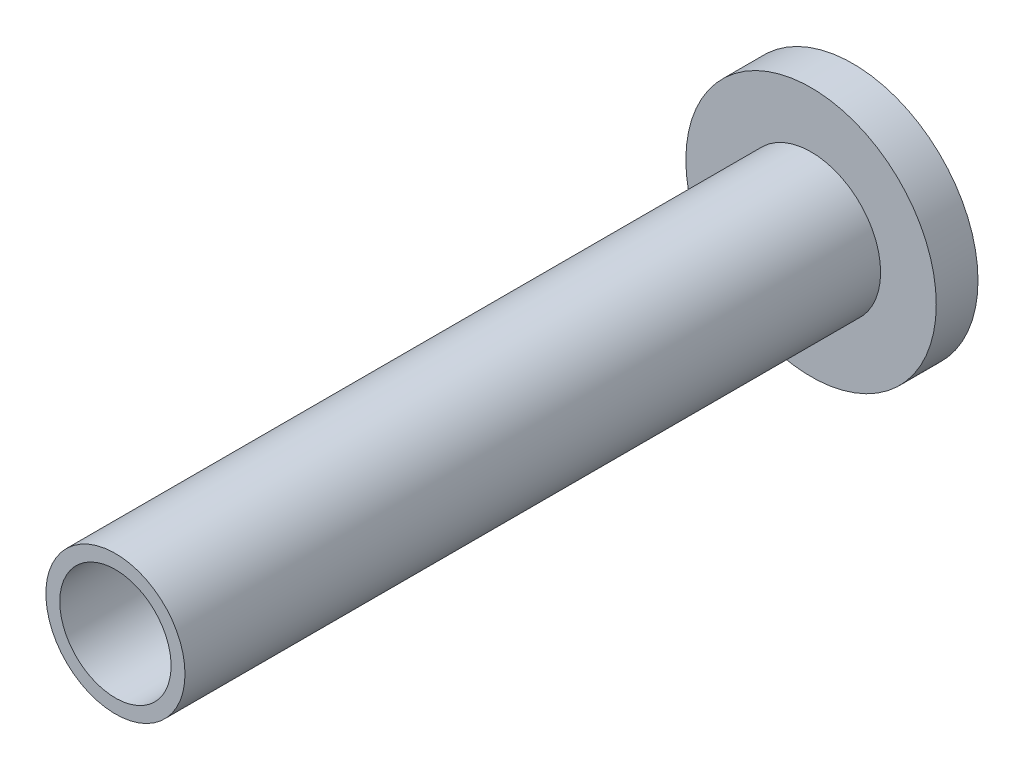
ISO-10303-21;
HEADER;
FILE_DESCRIPTION(('STEP AP214'),'2;1');
FILE_NAME('part.step','',(''),(''),'','','');
FILE_SCHEMA(('AUTOMOTIVE_DESIGN { 1 0 10303 214 1 1 1 1 }'));
ENDSEC;
DATA;
#1=APPLICATION_CONTEXT('core data for automotive mechanical design processes');
#2=APPLICATION_PROTOCOL_DEFINITION('international standard','automotive_design',2000,#1);
#3=PRODUCT_CONTEXT('',#1,'mechanical');
#4=PRODUCT('Part','Part','',(#3));
#5=PRODUCT_RELATED_PRODUCT_CATEGORY('part','',(#4));
#6=PRODUCT_DEFINITION_FORMATION('','',#4);
#7=PRODUCT_DEFINITION_CONTEXT('part definition',#1,'design');
#8=PRODUCT_DEFINITION('design','',#6,#7);
#9=PRODUCT_DEFINITION_SHAPE('','',#8);
#10=(LENGTH_UNIT() NAMED_UNIT(*) SI_UNIT(.MILLI.,.METRE.));
#11=(NAMED_UNIT(*) PLANE_ANGLE_UNIT() SI_UNIT($,.RADIAN.));
#12=(NAMED_UNIT(*) SI_UNIT($,.STERADIAN.) SOLID_ANGLE_UNIT());
#13=UNCERTAINTY_MEASURE_WITH_UNIT(LENGTH_MEASURE(1.E-05),#10,'distance_accuracy_value','');
#14=(GEOMETRIC_REPRESENTATION_CONTEXT(3) GLOBAL_UNCERTAINTY_ASSIGNED_CONTEXT((#13)) GLOBAL_UNIT_ASSIGNED_CONTEXT((#10,
#11,#12)) REPRESENTATION_CONTEXT('',''));
#15=CARTESIAN_POINT('',(0.,0.,0.));
#16=DIRECTION('',(0.,0.,1.));
#17=DIRECTION('',(1.,0.,0.));
#18=AXIS2_PLACEMENT_3D('',#15,#16,#17);
#19=CARTESIAN_POINT('',(0.,0.,25.));
#20=DIRECTION('',(0.,0.,-1.));
#21=DIRECTION('',(-1.,0.,0.));
#22=AXIS2_PLACEMENT_3D('',#19,#20,#21);
#23=CYLINDRICAL_SURFACE('',#22,2.5);
#24=CARTESIAN_POINT('',(0.,0.,25.));
#25=DIRECTION('',(0.,0.,1.));
#26=DIRECTION('',(1.,0.,0.));
#27=AXIS2_PLACEMENT_3D('',#24,#25,#26);
#28=CIRCLE('',#27,2.5);
#29=CARTESIAN_POINT('',(2.5,0.,25.));
#30=VERTEX_POINT('',#29);
#31=EDGE_CURVE('E11',#30,#30,#28,.T.);
#32=ORIENTED_EDGE('',*,*,#31,.F.);
#33=EDGE_LOOP('',(#32));
#34=FACE_BOUND('',#33,.T.);
#35=CARTESIAN_POINT('',(0.,0.,0.));
#36=DIRECTION('',(0.,0.,1.));
#37=DIRECTION('',(1.,0.,0.));
#38=AXIS2_PLACEMENT_3D('',#35,#36,#37);
#39=CIRCLE('',#38,2.5);
#40=CARTESIAN_POINT('',(2.5,0.,0.));
#41=VERTEX_POINT('',#40);
#42=EDGE_CURVE('E57',#41,#41,#39,.T.);
#43=ORIENTED_EDGE('',*,*,#42,.T.);
#44=EDGE_LOOP('',(#43));
#45=FACE_BOUND('',#44,.T.);
#46=ADVANCED_FACE('F49',(#34,#45),#23,.T.);
#47=CARTESIAN_POINT('',(0.,0.,25.));
#48=DIRECTION('',(0.,0.,1.));
#49=DIRECTION('',(1.,0.,0.));
#50=AXIS2_PLACEMENT_3D('',#47,#48,#49);
#51=PLANE('',#50);
#52=CARTESIAN_POINT('',(0.,0.,25.));
#53=DIRECTION('',(0.,0.,1.));
#54=DIRECTION('',(1.,0.,0.));
#55=AXIS2_PLACEMENT_3D('',#52,#53,#54);
#56=CIRCLE('',#55,2.);
#57=CARTESIAN_POINT('',(-2.,0.,25.));
#58=VERTEX_POINT('',#57);
#59=EDGE_CURVE('E52',#58,#58,#56,.F.);
#60=ORIENTED_EDGE('',*,*,#59,.T.);
#61=EDGE_LOOP('',(#60));
#62=FACE_BOUND('',#61,.T.);
#63=ORIENTED_EDGE('',*,*,#31,.T.);
#64=EDGE_LOOP('',(#63));
#65=FACE_BOUND('',#64,.T.);
#66=ADVANCED_FACE('F242',(#62,#65),#51,.T.);
#67=CARTESIAN_POINT('',(0.,0.,0.));
#68=DIRECTION('',(0.,0.,1.));
#69=DIRECTION('',(1.,0.,0.));
#70=AXIS2_PLACEMENT_3D('',#67,#68,#69);
#71=PLANE('',#70);
#72=CARTESIAN_POINT('',(0.,0.,0.));
#73=DIRECTION('',(0.,0.,1.));
#74=DIRECTION('',(1.,0.,0.));
#75=AXIS2_PLACEMENT_3D('',#72,#73,#74);
#76=CIRCLE('',#75,4.5);
#77=CARTESIAN_POINT('',(4.5,0.,0.));
#78=VERTEX_POINT('',#77);
#79=EDGE_CURVE('E159',#78,#78,#76,.T.);
#80=ORIENTED_EDGE('',*,*,#79,.T.);
#81=EDGE_LOOP('',(#80));
#82=FACE_BOUND('',#81,.T.);
#83=ORIENTED_EDGE('',*,*,#42,.F.);
#84=EDGE_LOOP('',(#83));
#85=FACE_BOUND('',#84,.T.);
#86=ADVANCED_FACE('F240',(#82,#85),#71,.T.);
#87=CARTESIAN_POINT('',(0.115769453402899,0.,-1.5));
#88=DIRECTION('',(1.,0.,0.));
#89=DIRECTION('',(0.,0.,-1.));
#90=AXIS2_PLACEMENT_3D('',#87,#88,#89);
#91=PLANE('',#90);
#92=DIRECTION('',(0.,1.,0.));
#93=VECTOR('',#92,1.);
#94=CARTESIAN_POINT('',(0.115769453402899,0.,0.));
#95=LINE('',#94,#93);
#96=CARTESIAN_POINT('',(0.115769453402899,-1.71873111590303,0.));
#97=VERTEX_POINT('',#96);
#98=CARTESIAN_POINT('',(0.115769453402899,-0.115769453402899,0.));
#99=VERTEX_POINT('',#98);
#100=EDGE_CURVE('E65',#97,#99,#95,.T.);
#101=ORIENTED_EDGE('',*,*,#100,.T.);
#102=DIRECTION('',(0.,0.,1.));
#103=VECTOR('',#102,1.);
#104=CARTESIAN_POINT('',(0.115769453402899,-0.115769453402899,-1.5));
#105=LINE('',#104,#103);
#106=CARTESIAN_POINT('',(0.115769453402899,-0.115769453402899,-1.5));
#107=VERTEX_POINT('',#106);
#108=EDGE_CURVE('E158',#107,#99,#105,.T.);
#109=ORIENTED_EDGE('',*,*,#108,.F.);
#110=DIRECTION('',(0.,1.,0.));
#111=VECTOR('',#110,1.);
#112=CARTESIAN_POINT('',(0.115769453402899,0.,-1.5));
#113=LINE('',#112,#111);
#114=CARTESIAN_POINT('',(0.115769453402899,-1.71873111590303,-1.5));
#115=VERTEX_POINT('',#114);
#116=EDGE_CURVE('E143',#115,#107,#113,.T.);
#117=ORIENTED_EDGE('',*,*,#116,.F.);
#118=DIRECTION('',(0.,0.,1.));
#119=VECTOR('',#118,1.);
#120=CARTESIAN_POINT('',(0.115769453402899,-1.71873111590303,-1.5));
#121=LINE('',#120,#119);
#122=EDGE_CURVE('E150',#115,#97,#121,.T.);
#123=ORIENTED_EDGE('',*,*,#122,.T.);
#124=EDGE_LOOP('',(#101,#109,#117,#123));
#125=FACE_BOUND('',#124,.T.);
#126=ADVANCED_FACE('F156',(#125),#91,.F.);
#127=CARTESIAN_POINT('',(0.,-0.115769453402899,-1.5));
#128=DIRECTION('',(0.,-1.,0.));
#129=DIRECTION('',(0.,0.,-1.));
#130=AXIS2_PLACEMENT_3D('',#127,#128,#129);
#131=PLANE('',#130);
#132=DIRECTION('',(1.,0.,0.));
#133=VECTOR('',#132,1.);
#134=CARTESIAN_POINT('',(0.,-0.115769453402899,0.));
#135=LINE('',#134,#133);
#136=CARTESIAN_POINT('',(1.71873111590303,-0.115769453402899,0.));
#137=VERTEX_POINT('',#136);
#138=EDGE_CURVE('E163',#99,#137,#135,.T.);
#139=ORIENTED_EDGE('',*,*,#138,.T.);
#140=DIRECTION('',(0.,0.,1.));
#141=VECTOR('',#140,1.);
#142=CARTESIAN_POINT('',(1.71873111590303,-0.115769453402899,-1.5));
#143=LINE('',#142,#141);
#144=CARTESIAN_POINT('',(1.71873111590303,-0.115769453402899,-1.5));
#145=VERTEX_POINT('',#144);
#146=EDGE_CURVE('E210',#145,#137,#143,.T.);
#147=ORIENTED_EDGE('',*,*,#146,.F.);
#148=DIRECTION('',(1.,0.,0.));
#149=VECTOR('',#148,1.);
#150=CARTESIAN_POINT('',(0.,-0.115769453402899,-1.5));
#151=LINE('',#150,#149);
#152=EDGE_CURVE('E187',#107,#145,#151,.T.);
#153=ORIENTED_EDGE('',*,*,#152,.F.);
#154=ORIENTED_EDGE('',*,*,#108,.T.);
#155=EDGE_LOOP('',(#139,#147,#153,#154));
#156=FACE_BOUND('',#155,.T.);
#157=ADVANCED_FACE('F249',(#156),#131,.F.);
#158=CARTESIAN_POINT('',(1.71873111590303,0.,-1.5));
#159=DIRECTION('',(-1.,0.,0.));
#160=DIRECTION('',(0.,0.,1.));
#161=AXIS2_PLACEMENT_3D('',#158,#159,#160);
#162=PLANE('',#161);
#163=DIRECTION('',(0.,-1.,0.));
#164=VECTOR('',#163,1.);
#165=CARTESIAN_POINT('',(1.71873111590303,0.,0.));
#166=LINE('',#165,#164);
#167=CARTESIAN_POINT('',(1.71873111590303,0.115769453402899,0.));
#168=VERTEX_POINT('',#167);
#169=EDGE_CURVE('E207',#168,#137,#166,.T.);
#170=ORIENTED_EDGE('',*,*,#169,.F.);
#171=DIRECTION('',(0.,0.,1.));
#172=VECTOR('',#171,1.);
#173=CARTESIAN_POINT('',(1.71873111590303,0.115769453402899,-1.5));
#174=LINE('',#173,#172);
#175=CARTESIAN_POINT('',(1.71873111590303,0.115769453402899,-1.5));
#176=VERTEX_POINT('',#175);
#177=EDGE_CURVE('E213',#176,#168,#174,.T.);
#178=ORIENTED_EDGE('',*,*,#177,.F.);
#179=DIRECTION('',(0.,-1.,0.));
#180=VECTOR('',#179,1.);
#181=CARTESIAN_POINT('',(1.71873111590303,0.,-1.5));
#182=LINE('',#181,#180);
#183=EDGE_CURVE('E173',#176,#145,#182,.T.);
#184=ORIENTED_EDGE('',*,*,#183,.T.);
#185=ORIENTED_EDGE('',*,*,#146,.T.);
#186=EDGE_LOOP('',(#170,#178,#184,#185));
#187=FACE_BOUND('',#186,.T.);
#188=ADVANCED_FACE('F298',(#187),#162,.T.);
#189=CARTESIAN_POINT('',(0.,0.115769453402899,-1.5));
#190=DIRECTION('',(0.,-1.,0.));
#191=DIRECTION('',(0.,0.,-1.));
#192=AXIS2_PLACEMENT_3D('',#189,#190,#191);
#193=PLANE('',#192);
#194=DIRECTION('',(1.,0.,0.));
#195=VECTOR('',#194,1.);
#196=CARTESIAN_POINT('',(0.,0.115769453402899,0.));
#197=LINE('',#196,#195);
#198=CARTESIAN_POINT('',(0.115769453402899,0.115769453402899,0.));
#199=VERTEX_POINT('',#198);
#200=EDGE_CURVE('E204',#199,#168,#197,.T.);
#201=ORIENTED_EDGE('',*,*,#200,.F.);
#202=DIRECTION('',(0.,0.,1.));
#203=VECTOR('',#202,1.);
#204=CARTESIAN_POINT('',(0.115769453402899,0.115769453402899,-1.5));
#205=LINE('',#204,#203);
#206=CARTESIAN_POINT('',(0.115769453402899,0.115769453402899,-1.5));
#207=VERTEX_POINT('',#206);
#208=EDGE_CURVE('E216',#207,#199,#205,.T.);
#209=ORIENTED_EDGE('',*,*,#208,.F.);
#210=DIRECTION('',(1.,0.,0.));
#211=VECTOR('',#210,1.);
#212=CARTESIAN_POINT('',(0.,0.115769453402899,-1.5));
#213=LINE('',#212,#211);
#214=EDGE_CURVE('E166',#207,#176,#213,.T.);
#215=ORIENTED_EDGE('',*,*,#214,.T.);
#216=ORIENTED_EDGE('',*,*,#177,.T.);
#217=EDGE_LOOP('',(#201,#209,#215,#216));
#218=FACE_BOUND('',#217,.T.);
#219=ADVANCED_FACE('F309',(#218),#193,.T.);
#220=CARTESIAN_POINT('',(0.115769453402899,1.71873111590303,0.));
#221=VERTEX_POINT('',#220);
#222=EDGE_CURVE('E191',#199,#221,#95,.T.);
#223=ORIENTED_EDGE('',*,*,#222,.T.);
#224=DIRECTION('',(0.,0.,1.));
#225=VECTOR('',#224,1.);
#226=CARTESIAN_POINT('',(0.115769453402899,1.71873111590303,-1.5));
#227=LINE('',#226,#225);
#228=CARTESIAN_POINT('',(0.115769453402899,1.71873111590303,-1.5));
#229=VERTEX_POINT('',#228);
#230=EDGE_CURVE('E219',#229,#221,#227,.T.);
#231=ORIENTED_EDGE('',*,*,#230,.F.);
#232=EDGE_CURVE('E161',#207,#229,#113,.T.);
#233=ORIENTED_EDGE('',*,*,#232,.F.);
#234=ORIENTED_EDGE('',*,*,#208,.T.);
#235=EDGE_LOOP('',(#223,#231,#233,#234));
#236=FACE_BOUND('',#235,.T.);
#237=ADVANCED_FACE('F251',(#236),#91,.F.);
#238=CARTESIAN_POINT('',(0.,1.71873111590303,-1.5));
#239=DIRECTION('',(0.,-1.,0.));
#240=DIRECTION('',(0.,0.,-1.));
#241=AXIS2_PLACEMENT_3D('',#238,#239,#240);
#242=PLANE('',#241);
#243=DIRECTION('',(1.,0.,0.));
#244=VECTOR('',#243,1.);
#245=CARTESIAN_POINT('',(0.,1.71873111590303,0.));
#246=LINE('',#245,#244);
#247=CARTESIAN_POINT('',(-0.115769453402899,1.71873111590303,0.));
#248=VERTEX_POINT('',#247);
#249=EDGE_CURVE('E205',#248,#221,#246,.T.);
#250=ORIENTED_EDGE('',*,*,#249,.F.);
#251=DIRECTION('',(0.,0.,1.));
#252=VECTOR('',#251,1.);
#253=CARTESIAN_POINT('',(-0.115769453402899,1.71873111590303,-1.5));
#254=LINE('',#253,#252);
#255=CARTESIAN_POINT('',(-0.115769453402899,1.71873111590303,-1.5));
#256=VERTEX_POINT('',#255);
#257=EDGE_CURVE('E221',#256,#248,#254,.T.);
#258=ORIENTED_EDGE('',*,*,#257,.F.);
#259=DIRECTION('',(1.,0.,0.));
#260=VECTOR('',#259,1.);
#261=CARTESIAN_POINT('',(0.,1.71873111590303,-1.5));
#262=LINE('',#261,#260);
#263=EDGE_CURVE('E167',#256,#229,#262,.T.);
#264=ORIENTED_EDGE('',*,*,#263,.T.);
#265=ORIENTED_EDGE('',*,*,#230,.T.);
#266=EDGE_LOOP('',(#250,#258,#264,#265));
#267=FACE_BOUND('',#266,.T.);
#268=ADVANCED_FACE('F329',(#267),#242,.T.);
#269=CARTESIAN_POINT('',(-0.115769453402899,0.,-1.5));
#270=DIRECTION('',(1.,0.,0.));
#271=DIRECTION('',(0.,0.,-1.));
#272=AXIS2_PLACEMENT_3D('',#269,#270,#271);
#273=PLANE('',#272);
#274=DIRECTION('',(0.,1.,0.));
#275=VECTOR('',#274,1.);
#276=CARTESIAN_POINT('',(-0.115769453402899,0.,0.));
#277=LINE('',#276,#275);
#278=CARTESIAN_POINT('',(-0.115769453402899,0.115769453402899,0.));
#279=VERTEX_POINT('',#278);
#280=EDGE_CURVE('E196',#279,#248,#277,.T.);
#281=ORIENTED_EDGE('',*,*,#280,.F.);
#282=DIRECTION('',(0.,0.,1.));
#283=VECTOR('',#282,1.);
#284=CARTESIAN_POINT('',(-0.115769453402899,0.115769453402899,-1.5));
#285=LINE('',#284,#283);
#286=CARTESIAN_POINT('',(-0.115769453402899,0.115769453402899,-1.5));
#287=VERTEX_POINT('',#286);
#288=EDGE_CURVE('E224',#287,#279,#285,.T.);
#289=ORIENTED_EDGE('',*,*,#288,.F.);
#290=DIRECTION('',(0.,1.,0.));
#291=VECTOR('',#290,1.);
#292=CARTESIAN_POINT('',(-0.115769453402899,0.,-1.5));
#293=LINE('',#292,#291);
#294=EDGE_CURVE('E177',#287,#256,#293,.T.);
#295=ORIENTED_EDGE('',*,*,#294,.T.);
#296=ORIENTED_EDGE('',*,*,#257,.T.);
#297=EDGE_LOOP('',(#281,#289,#295,#296));
#298=FACE_BOUND('',#297,.T.);
#299=ADVANCED_FACE('F338',(#298),#273,.T.);
#300=CARTESIAN_POINT('',(-1.71873111590303,0.115769453402899,0.));
#301=VERTEX_POINT('',#300);
#302=EDGE_CURVE('E202',#301,#279,#197,.T.);
#303=ORIENTED_EDGE('',*,*,#302,.F.);
#304=DIRECTION('',(0.,0.,1.));
#305=VECTOR('',#304,1.);
#306=CARTESIAN_POINT('',(-1.71873111590303,0.115769453402899,-1.5));
#307=LINE('',#306,#305);
#308=CARTESIAN_POINT('',(-1.71873111590303,0.115769453402899,-1.5));
#309=VERTEX_POINT('',#308);
#310=EDGE_CURVE('E227',#309,#301,#307,.T.);
#311=ORIENTED_EDGE('',*,*,#310,.F.);
#312=EDGE_CURVE('E175',#309,#287,#213,.T.);
#313=ORIENTED_EDGE('',*,*,#312,.T.);
#314=ORIENTED_EDGE('',*,*,#288,.T.);
#315=EDGE_LOOP('',(#303,#311,#313,#314));
#316=FACE_BOUND('',#315,.T.);
#317=ADVANCED_FACE('F321',(#316),#193,.T.);
#318=CARTESIAN_POINT('',(-1.71873111590303,0.,-1.5));
#319=DIRECTION('',(-1.,0.,0.));
#320=DIRECTION('',(0.,0.,1.));
#321=AXIS2_PLACEMENT_3D('',#318,#319,#320);
#322=PLANE('',#321);
#323=DIRECTION('',(0.,-1.,0.));
#324=VECTOR('',#323,1.);
#325=CARTESIAN_POINT('',(-1.71873111590303,0.,0.));
#326=LINE('',#325,#324);
#327=CARTESIAN_POINT('',(-1.71873111590303,-0.115769453402899,0.));
#328=VERTEX_POINT('',#327);
#329=EDGE_CURVE('E199',#301,#328,#326,.T.);
#330=ORIENTED_EDGE('',*,*,#329,.T.);
#331=DIRECTION('',(0.,0.,1.));
#332=VECTOR('',#331,1.);
#333=CARTESIAN_POINT('',(-1.71873111590303,-0.115769453402899,-1.5));
#334=LINE('',#333,#332);
#335=CARTESIAN_POINT('',(-1.71873111590303,-0.115769453402899,-1.5));
#336=VERTEX_POINT('',#335);
#337=EDGE_CURVE('E230',#336,#328,#334,.T.);
#338=ORIENTED_EDGE('',*,*,#337,.F.);
#339=DIRECTION('',(0.,-1.,0.));
#340=VECTOR('',#339,1.);
#341=CARTESIAN_POINT('',(-1.71873111590303,0.,-1.5));
#342=LINE('',#341,#340);
#343=EDGE_CURVE('E453',#309,#336,#342,.T.);
#344=ORIENTED_EDGE('',*,*,#343,.F.);
#345=ORIENTED_EDGE('',*,*,#310,.T.);
#346=EDGE_LOOP('',(#330,#338,#344,#345));
#347=FACE_BOUND('',#346,.T.);
#348=ADVANCED_FACE('F357',(#347),#322,.F.);
#349=CARTESIAN_POINT('',(-0.115769453402899,-0.115769453402899,0.));
#350=VERTEX_POINT('',#349);
#351=EDGE_CURVE('E195',#328,#350,#135,.T.);
#352=ORIENTED_EDGE('',*,*,#351,.T.);
#353=DIRECTION('',(0.,0.,1.));
#354=VECTOR('',#353,1.);
#355=CARTESIAN_POINT('',(-0.115769453402899,-0.115769453402899,-1.5));
#356=LINE('',#355,#354);
#357=CARTESIAN_POINT('',(-0.115769453402899,-0.115769453402899,-1.5));
#358=VERTEX_POINT('',#357);
#359=EDGE_CURVE('E233',#358,#350,#356,.T.);
#360=ORIENTED_EDGE('',*,*,#359,.F.);
#361=EDGE_CURVE('E452',#336,#358,#151,.T.);
#362=ORIENTED_EDGE('',*,*,#361,.F.);
#363=ORIENTED_EDGE('',*,*,#337,.T.);
#364=EDGE_LOOP('',(#352,#360,#362,#363));
#365=FACE_BOUND('',#364,.T.);
#366=ADVANCED_FACE('F301',(#365),#131,.F.);
#367=CARTESIAN_POINT('',(-0.115769453402899,-1.71873111590303,0.));
#368=VERTEX_POINT('',#367);
#369=EDGE_CURVE('E193',#368,#350,#277,.T.);
#370=ORIENTED_EDGE('',*,*,#369,.F.);
#371=DIRECTION('',(0.,0.,1.));
#372=VECTOR('',#371,1.);
#373=CARTESIAN_POINT('',(-0.115769453402899,-1.71873111590303,-1.5));
#374=LINE('',#373,#372);
#375=CARTESIAN_POINT('',(-0.115769453402899,-1.71873111590303,-1.5));
#376=VERTEX_POINT('',#375);
#377=EDGE_CURVE('E153',#376,#368,#374,.T.);
#378=ORIENTED_EDGE('',*,*,#377,.F.);
#379=EDGE_CURVE('E146',#376,#358,#293,.T.);
#380=ORIENTED_EDGE('',*,*,#379,.T.);
#381=ORIENTED_EDGE('',*,*,#359,.T.);
#382=EDGE_LOOP('',(#370,#378,#380,#381));
#383=FACE_BOUND('',#382,.T.);
#384=ADVANCED_FACE('F349',(#383),#273,.T.);
#385=CARTESIAN_POINT('',(0.,-1.71873111590303,-1.5));
#386=DIRECTION('',(0.,-1.,0.));
#387=DIRECTION('',(0.,0.,-1.));
#388=AXIS2_PLACEMENT_3D('',#385,#386,#387);
#389=PLANE('',#388);
#390=DIRECTION('',(1.,0.,0.));
#391=VECTOR('',#390,1.);
#392=CARTESIAN_POINT('',(0.,-1.71873111590303,0.));
#393=LINE('',#392,#391);
#394=EDGE_CURVE('E69',#368,#97,#393,.T.);
#395=ORIENTED_EDGE('',*,*,#394,.T.);
#396=ORIENTED_EDGE('',*,*,#122,.F.);
#397=DIRECTION('',(1.,0.,0.));
#398=VECTOR('',#397,1.);
#399=CARTESIAN_POINT('',(0.,-1.71873111590303,-1.5));
#400=LINE('',#399,#398);
#401=EDGE_CURVE('E138',#376,#115,#400,.T.);
#402=ORIENTED_EDGE('',*,*,#401,.F.);
#403=ORIENTED_EDGE('',*,*,#377,.T.);
#404=EDGE_LOOP('',(#395,#396,#402,#403));
#405=FACE_BOUND('',#404,.T.);
#406=ADVANCED_FACE('F151',(#405),#389,.F.);
#407=CARTESIAN_POINT('',(0.,0.,-1.5));
#408=DIRECTION('',(0.,0.,1.));
#409=DIRECTION('',(1.,0.,0.));
#410=AXIS2_PLACEMENT_3D('',#407,#408,#409);
#411=CYLINDRICAL_SURFACE('',#410,4.5);
#412=CARTESIAN_POINT('',(0.,0.,-1.5));
#413=DIRECTION('',(0.,0.,1.));
#414=DIRECTION('',(1.,0.,0.));
#415=AXIS2_PLACEMENT_3D('',#412,#413,#414);
#416=CIRCLE('',#415,4.5);
#417=CARTESIAN_POINT('',(4.5,0.,-1.5));
#418=VERTEX_POINT('',#417);
#419=EDGE_CURVE('E154',#418,#418,#416,.T.);
#420=ORIENTED_EDGE('',*,*,#419,.T.);
#421=EDGE_LOOP('',(#420));
#422=FACE_BOUND('',#421,.T.);
#423=ORIENTED_EDGE('',*,*,#79,.F.);
#424=EDGE_LOOP('',(#423));
#425=FACE_BOUND('',#424,.T.);
#426=ADVANCED_FACE('F391',(#422,#425),#411,.T.);
#427=CARTESIAN_POINT('',(0.,0.,-1.5));
#428=DIRECTION('',(0.,0.,1.));
#429=DIRECTION('',(1.,0.,0.));
#430=AXIS2_PLACEMENT_3D('',#427,#428,#429);
#431=PLANE('',#430);
#432=ORIENTED_EDGE('',*,*,#116,.T.);
#433=ORIENTED_EDGE('',*,*,#152,.T.);
#434=ORIENTED_EDGE('',*,*,#183,.F.);
#435=ORIENTED_EDGE('',*,*,#214,.F.);
#436=ORIENTED_EDGE('',*,*,#232,.T.);
#437=ORIENTED_EDGE('',*,*,#263,.F.);
#438=ORIENTED_EDGE('',*,*,#294,.F.);
#439=ORIENTED_EDGE('',*,*,#312,.F.);
#440=ORIENTED_EDGE('',*,*,#343,.T.);
#441=ORIENTED_EDGE('',*,*,#361,.T.);
#442=ORIENTED_EDGE('',*,*,#379,.F.);
#443=ORIENTED_EDGE('',*,*,#401,.T.);
#444=EDGE_LOOP('',(#432,#433,#434,#435,#436,#437,#438,#439,#440,#441,#442,#443));
#445=FACE_BOUND('',#444,.T.);
#446=ORIENTED_EDGE('',*,*,#419,.F.);
#447=EDGE_LOOP('',(#446));
#448=FACE_BOUND('',#447,.T.);
#449=ADVANCED_FACE('F140',(#445,#448),#431,.F.);
#450=CARTESIAN_POINT('',(0.,0.,0.));
#451=DIRECTION('',(0.,0.,1.));
#452=DIRECTION('',(1.,0.,0.));
#453=AXIS2_PLACEMENT_3D('',#450,#451,#452);
#454=PLANE('',#453);
#455=ORIENTED_EDGE('',*,*,#100,.F.);
#456=ORIENTED_EDGE('',*,*,#394,.F.);
#457=ORIENTED_EDGE('',*,*,#369,.T.);
#458=ORIENTED_EDGE('',*,*,#351,.F.);
#459=ORIENTED_EDGE('',*,*,#329,.F.);
#460=ORIENTED_EDGE('',*,*,#302,.T.);
#461=ORIENTED_EDGE('',*,*,#280,.T.);
#462=ORIENTED_EDGE('',*,*,#249,.T.);
#463=ORIENTED_EDGE('',*,*,#222,.F.);
#464=ORIENTED_EDGE('',*,*,#200,.T.);
#465=ORIENTED_EDGE('',*,*,#169,.T.);
#466=ORIENTED_EDGE('',*,*,#138,.F.);
#467=EDGE_LOOP('',(#455,#456,#457,#458,#459,#460,#461,#462,#463,#464,#465,#466));
#468=FACE_BOUND('',#467,.T.);
#469=ADVANCED_FACE('F277',(#468),#454,.F.);
#470=CARTESIAN_POINT('',(0.,0.,25.000012));
#471=DIRECTION('',(0.,0.,-1.));
#472=DIRECTION('',(-1.,0.,0.));
#473=AXIS2_PLACEMENT_3D('',#470,#471,#472);
#474=CYLINDRICAL_SURFACE('',#473,2.);
#475=CARTESIAN_POINT('',(0.,0.,15.));
#476=DIRECTION('',(0.,0.,1.));
#477=DIRECTION('',(1.,0.,0.));
#478=AXIS2_PLACEMENT_3D('',#475,#476,#477);
#479=CIRCLE('',#478,2.);
#480=CARTESIAN_POINT('',(-2.,0.,15.));
#481=VERTEX_POINT('',#480);
#482=EDGE_CURVE('E431',#481,#481,#479,.T.);
#483=CARTESIAN_POINT('',(-2.,0.,25.));
#484=CARTESIAN_POINT('',(-2.,0.,24.8958333333333));
#485=CARTESIAN_POINT('',(-2.,0.,24.7916666666667));
#486=CARTESIAN_POINT('',(-2.,0.,24.5833333333333));
#487=CARTESIAN_POINT('',(-2.,0.,24.4791666666667));
#488=CARTESIAN_POINT('',(-2.,0.,24.2708333333333));
#489=CARTESIAN_POINT('',(-2.,0.,24.1666666666667));
#490=CARTESIAN_POINT('',(-2.,0.,23.9583333333333));
#491=CARTESIAN_POINT('',(-2.,0.,23.8541666666667));
#492=CARTESIAN_POINT('',(-2.,0.,23.6458333333333));
#493=CARTESIAN_POINT('',(-2.,0.,23.5416666666667));
#494=CARTESIAN_POINT('',(-2.,0.,23.3333333333333));
#495=CARTESIAN_POINT('',(-2.,0.,23.2291666666667));
#496=CARTESIAN_POINT('',(-2.,0.,23.0208333333333));
#497=CARTESIAN_POINT('',(-2.,0.,22.9166666666667));
#498=CARTESIAN_POINT('',(-2.,0.,22.7083333333333));
#499=CARTESIAN_POINT('',(-2.,0.,22.6041666666667));
#500=CARTESIAN_POINT('',(-2.,0.,22.3958333333333));
#501=CARTESIAN_POINT('',(-2.,0.,22.2916666666667));
#502=CARTESIAN_POINT('',(-2.,0.,22.0833333333333));
#503=CARTESIAN_POINT('',(-2.,0.,21.9791666666667));
#504=CARTESIAN_POINT('',(-2.,0.,21.7708333333333));
#505=CARTESIAN_POINT('',(-2.,0.,21.6666666666667));
#506=CARTESIAN_POINT('',(-2.,0.,21.4583333333333));
#507=CARTESIAN_POINT('',(-2.,0.,21.3541666666667));
#508=CARTESIAN_POINT('',(-2.,0.,21.1458333333333));
#509=CARTESIAN_POINT('',(-2.,0.,21.0416666666667));
#510=CARTESIAN_POINT('',(-2.,0.,20.8333333333333));
#511=CARTESIAN_POINT('',(-2.,0.,20.7291666666667));
#512=CARTESIAN_POINT('',(-2.,0.,20.5208333333333));
#513=CARTESIAN_POINT('',(-2.,0.,20.4166666666667));
#514=CARTESIAN_POINT('',(-2.,0.,20.2083333333333));
#515=CARTESIAN_POINT('',(-2.,0.,20.1041666666667));
#516=CARTESIAN_POINT('',(-2.,0.,19.8958333333333));
#517=CARTESIAN_POINT('',(-2.,0.,19.7916666666667));
#518=CARTESIAN_POINT('',(-2.,0.,19.5833333333333));
#519=CARTESIAN_POINT('',(-2.,0.,19.4791666666667));
#520=CARTESIAN_POINT('',(-2.,0.,19.2708333333333));
#521=CARTESIAN_POINT('',(-2.,0.,19.1666666666667));
#522=CARTESIAN_POINT('',(-2.,0.,18.9583333333333));
#523=CARTESIAN_POINT('',(-2.,0.,18.8541666666667));
#524=CARTESIAN_POINT('',(-2.,0.,18.6458333333333));
#525=CARTESIAN_POINT('',(-2.,0.,18.5416666666667));
#526=CARTESIAN_POINT('',(-2.,0.,18.3333333333333));
#527=CARTESIAN_POINT('',(-2.,0.,18.2291666666667));
#528=CARTESIAN_POINT('',(-2.,0.,18.0208333333333));
#529=CARTESIAN_POINT('',(-2.,0.,17.9166666666667));
#530=CARTESIAN_POINT('',(-2.,0.,17.7083333333333));
#531=CARTESIAN_POINT('',(-2.,0.,17.6041666666667));
#532=CARTESIAN_POINT('',(-2.,0.,17.3958333333333));
#533=CARTESIAN_POINT('',(-2.,0.,17.2916666666667));
#534=CARTESIAN_POINT('',(-2.,0.,17.0833333333333));
#535=CARTESIAN_POINT('',(-2.,0.,16.9791666666667));
#536=CARTESIAN_POINT('',(-2.,0.,16.7708333333333));
#537=CARTESIAN_POINT('',(-2.,0.,16.6666666666667));
#538=CARTESIAN_POINT('',(-2.,0.,16.4583333333333));
#539=CARTESIAN_POINT('',(-2.,0.,16.3541666666667));
#540=CARTESIAN_POINT('',(-2.,0.,16.1458333333333));
#541=CARTESIAN_POINT('',(-2.,0.,16.0416666666667));
#542=CARTESIAN_POINT('',(-2.,0.,15.8333333333333));
#543=CARTESIAN_POINT('',(-2.,0.,15.7291666666667));
#544=CARTESIAN_POINT('',(-2.,0.,15.5208333333333));
#545=CARTESIAN_POINT('',(-2.,0.,15.4166666666667));
#546=CARTESIAN_POINT('',(-2.,0.,15.2083333333333));
#547=CARTESIAN_POINT('',(-2.,0.,15.1041666666667));
#548=CARTESIAN_POINT('',(-2.,0.,15.));
#549=B_SPLINE_CURVE_WITH_KNOTS('',3,(#483,#484,#485,#486,#487,#488,#489,#490,#491,#492,#493,
#494,#495,#496,#497,#498,#499,#500,#501,#502,#503,#504,#505,#506,#507,#508,#509,#510,#511,#512,
#513,#514,#515,#516,#517,#518,#519,#520,#521,#522,#523,#524,#525,#526,#527,#528,#529,#530,#531,
#532,#533,#534,#535,#536,#537,#538,#539,#540,#541,#542,#543,#544,#545,#546,#547,#548),
.UNSPECIFIED.,.F.,.F.,(4,2,2,2,2,2,2,2,2,2,2,2,2,2,2,2,2,2,2,2,2,2,2,2,2,2,2,2,2,2,2,2,4),(0.,
0.312499999999997,0.624999999999997,0.937499999999997,1.25,1.5625,1.875,2.1875,2.5,2.8125,3.125,
3.4375,3.75,4.0625,4.375,4.6875,5.,5.3125,5.625,5.9375,6.25,6.5625,6.875,7.1875,7.5,7.8125,
8.125,8.4375,8.75,9.0625,9.375,9.6875,10.),.UNSPECIFIED.);
#550=EDGE_CURVE('BSEAM280',#58,#481,#549,.T.);
#551=ORIENTED_EDGE('',*,*,#59,.F.);
#552=ORIENTED_EDGE('',*,*,#482,.F.);
#553=ORIENTED_EDGE('',*,*,#550,.T.);
#554=ORIENTED_EDGE('',*,*,#550,.F.);
#555=EDGE_LOOP('',(#551,#553,#552,#554));
#556=FACE_BOUND('',#555,.T.);
#557=ADVANCED_FACE('F280',(#556),#474,.F.);
#558=CARTESIAN_POINT('',(0.,0.,15.));
#559=DIRECTION('',(0.,0.,1.));
#560=DIRECTION('',(1.,0.,0.));
#561=AXIS2_PLACEMENT_3D('',#558,#559,#560);
#562=PLANE('',#561);
#563=ORIENTED_EDGE('',*,*,#482,.T.);
#564=EDGE_LOOP('',(#563));
#565=FACE_BOUND('',#564,.T.);
#566=ADVANCED_FACE('F415',(#565),#562,.T.);
#567=CLOSED_SHELL('',(#46,#66,#86,#126,#157,#188,#219,#237,#268,#299,#317,#348,#366,#384,#406,
#426,#449,#469,#557,#566));
#568=MANIFOLD_SOLID_BREP('B2',#567);
#569=ADVANCED_BREP_SHAPE_REPRESENTATION('',(#18,#568),#14);
#570=SHAPE_DEFINITION_REPRESENTATION(#9,#569);
ENDSEC;
END-ISO-10303-21;
